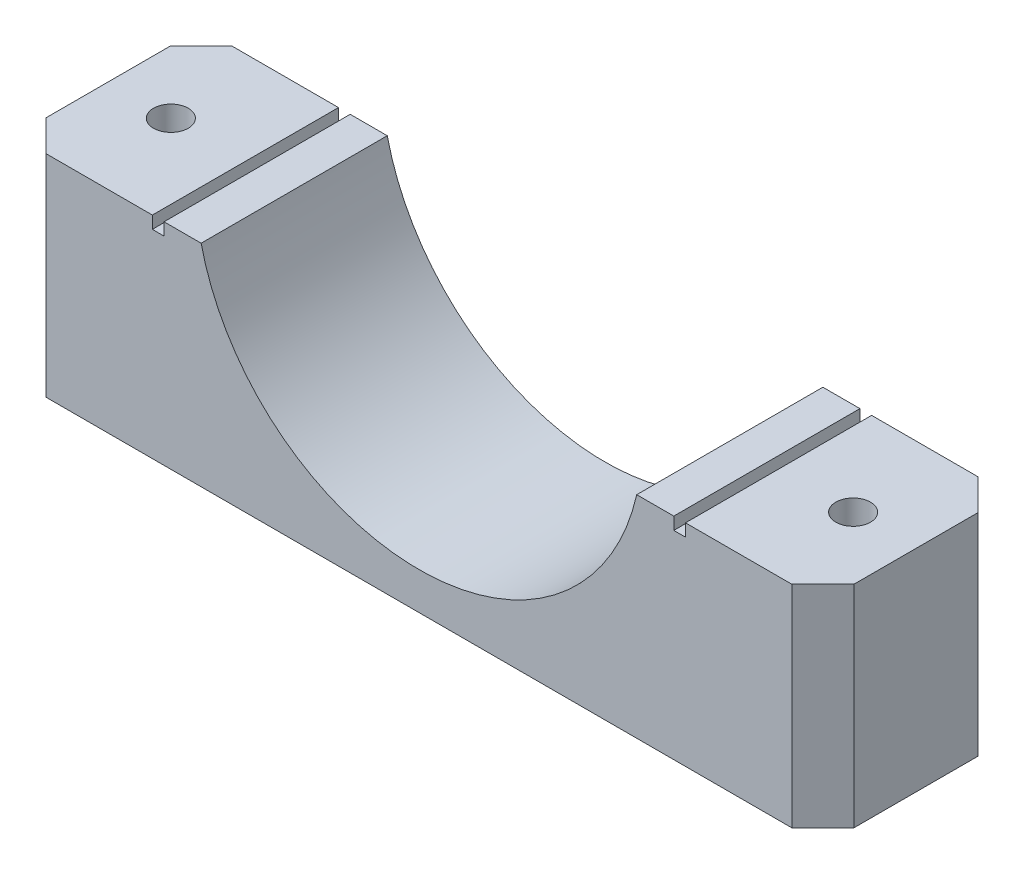
ISO-10303-21;
HEADER;
FILE_DESCRIPTION(('STEP AP214'),'2;1');
FILE_NAME('part.step','',(''),(''),'','','');
FILE_SCHEMA(('AUTOMOTIVE_DESIGN { 1 0 10303 214 1 1 1 1 }'));
ENDSEC;
DATA;
#1=APPLICATION_CONTEXT('core data for automotive mechanical design processes');
#2=APPLICATION_PROTOCOL_DEFINITION('international standard','automotive_design',2000,#1);
#3=PRODUCT_CONTEXT('',#1,'mechanical');
#4=PRODUCT('Part','Part','',(#3));
#5=PRODUCT_RELATED_PRODUCT_CATEGORY('part','',(#4));
#6=PRODUCT_DEFINITION_FORMATION('','',#4);
#7=PRODUCT_DEFINITION_CONTEXT('part definition',#1,'design');
#8=PRODUCT_DEFINITION('design','',#6,#7);
#9=PRODUCT_DEFINITION_SHAPE('','',#8);
#10=(LENGTH_UNIT() NAMED_UNIT(*) SI_UNIT(.MILLI.,.METRE.));
#11=(NAMED_UNIT(*) PLANE_ANGLE_UNIT() SI_UNIT($,.RADIAN.));
#12=(NAMED_UNIT(*) SI_UNIT($,.STERADIAN.) SOLID_ANGLE_UNIT());
#13=UNCERTAINTY_MEASURE_WITH_UNIT(LENGTH_MEASURE(1.E-05),#10,'distance_accuracy_value','');
#14=(GEOMETRIC_REPRESENTATION_CONTEXT(3) GLOBAL_UNCERTAINTY_ASSIGNED_CONTEXT((#13)) GLOBAL_UNIT_ASSIGNED_CONTEXT((#10,
#11,#12)) REPRESENTATION_CONTEXT('',''));
#15=CARTESIAN_POINT('',(0.,0.,0.));
#16=DIRECTION('',(0.,0.,1.));
#17=DIRECTION('',(1.,0.,0.));
#18=AXIS2_PLACEMENT_3D('',#15,#16,#17);
#19=CARTESIAN_POINT('',(32.5499287747842,-4.,15.));
#20=DIRECTION('',(0.,-1.,0.));
#21=DIRECTION('',(1.,0.,0.));
#22=AXIS2_PLACEMENT_3D('',#19,#20,#21);
#23=PLANE('',#22);
#24=CARTESIAN_POINT('',(27.4886444805463,-4.,7.50000000000003));
#25=DIRECTION('',(0.,1.,0.));
#26=DIRECTION('',(-1.,0.,0.));
#27=AXIS2_PLACEMENT_3D('',#24,#25,#26);
#28=CIRCLE('',#27,1.4);
#29=CARTESIAN_POINT('',(26.0886444805463,-4.,7.50000000000003));
#30=VERTEX_POINT('',#29);
#31=EDGE_CURVE('E226',#30,#30,#28,.T.);
#32=ORIENTED_EDGE('',*,*,#31,.F.);
#33=EDGE_LOOP('',(#32));
#34=FACE_BOUND('',#33,.T.);
#35=DIRECTION('',(0.,0.,1.));
#36=VECTOR('',#35,1.);
#37=CARTESIAN_POINT('',(21.4797362047984,-4.,0.));
#38=LINE('',#37,#36);
#39=CARTESIAN_POINT('',(21.4797362047984,-4.,0.));
#40=VERTEX_POINT('',#39);
#41=CARTESIAN_POINT('',(21.4797362047984,-4.,15.));
#42=VERTEX_POINT('',#41);
#43=EDGE_CURVE('E329',#40,#42,#38,.T.);
#44=ORIENTED_EDGE('',*,*,#43,.T.);
#45=DIRECTION('',(-1.,0.,0.));
#46=VECTOR('',#45,1.);
#47=CARTESIAN_POINT('',(32.5499287747842,-4.,15.));
#48=LINE('',#47,#46);
#49=CARTESIAN_POINT('',(30.0499287747842,-4.,15.));
#50=VERTEX_POINT('',#49);
#51=EDGE_CURVE('E189',#50,#42,#48,.T.);
#52=ORIENTED_EDGE('',*,*,#51,.F.);
#53=DIRECTION('',(0.707106781186548,0.,-0.707106781186548));
#54=VECTOR('',#53,1.);
#55=CARTESIAN_POINT('',(30.0499287747842,-4.,15.));
#56=LINE('',#55,#54);
#57=CARTESIAN_POINT('',(32.5499287747842,-4.,12.5));
#58=VERTEX_POINT('',#57);
#59=EDGE_CURVE('E281',#50,#58,#56,.T.);
#60=ORIENTED_EDGE('',*,*,#59,.T.);
#61=DIRECTION('',(0.,0.,-1.));
#62=VECTOR('',#61,1.);
#63=CARTESIAN_POINT('',(32.5499287747842,-4.,15.));
#64=LINE('',#63,#62);
#65=CARTESIAN_POINT('',(32.5499287747842,-4.,2.5));
#66=VERTEX_POINT('',#65);
#67=EDGE_CURVE('E273',#58,#66,#64,.T.);
#68=ORIENTED_EDGE('',*,*,#67,.T.);
#69=DIRECTION('',(0.707106781186548,0.,0.707106781186547));
#70=VECTOR('',#69,1.);
#71=CARTESIAN_POINT('',(32.5499287747842,-4.,2.5));
#72=LINE('',#71,#70);
#73=CARTESIAN_POINT('',(30.0499287747842,-4.,0.));
#74=VERTEX_POINT('',#73);
#75=EDGE_CURVE('E283',#66,#74,#72,.F.);
#76=ORIENTED_EDGE('',*,*,#75,.T.);
#77=DIRECTION('',(-1.,0.,0.));
#78=VECTOR('',#77,1.);
#79=CARTESIAN_POINT('',(32.5499287747842,-4.,0.));
#80=LINE('',#79,#78);
#81=EDGE_CURVE('E247',#74,#40,#80,.T.);
#82=ORIENTED_EDGE('',*,*,#81,.T.);
#83=EDGE_LOOP('',(#44,#52,#60,#68,#76,#82));
#84=FACE_BOUND('',#83,.T.);
#85=ADVANCED_FACE('F43',(#34,#84),#23,.F.);
#86=CARTESIAN_POINT('',(-17.5499287747842,-4.,15.));
#87=DIRECTION('',(0.,-1.,0.));
#88=DIRECTION('',(1.,0.,0.));
#89=AXIS2_PLACEMENT_3D('',#86,#87,#88);
#90=PLANE('',#89);
#91=DIRECTION('',(0.,0.,1.));
#92=VECTOR('',#91,1.);
#93=CARTESIAN_POINT('',(-20.5370518572524,-4.,0.));
#94=LINE('',#93,#92);
#95=CARTESIAN_POINT('',(-20.5370518572524,-4.,0.));
#96=VERTEX_POINT('',#95);
#97=CARTESIAN_POINT('',(-20.5370518572524,-4.,15.));
#98=VERTEX_POINT('',#97);
#99=EDGE_CURVE('E207',#96,#98,#94,.T.);
#100=ORIENTED_EDGE('',*,*,#99,.T.);
#101=DIRECTION('',(-1.,0.,0.));
#102=VECTOR('',#101,1.);
#103=CARTESIAN_POINT('',(-17.5499287747842,-4.,15.));
#104=LINE('',#103,#102);
#105=CARTESIAN_POINT('',(-17.5499287747842,-4.,15.));
#106=VERTEX_POINT('',#105);
#107=EDGE_CURVE('E240',#106,#98,#104,.T.);
#108=ORIENTED_EDGE('',*,*,#107,.F.);
#109=DIRECTION('',(0.,0.,-1.));
#110=VECTOR('',#109,1.);
#111=CARTESIAN_POINT('',(-17.5499287747842,-4.,15.));
#112=LINE('',#111,#110);
#113=CARTESIAN_POINT('',(-17.5499287747842,-4.,0.));
#114=VERTEX_POINT('',#113);
#115=EDGE_CURVE('E268',#106,#114,#112,.T.);
#116=ORIENTED_EDGE('',*,*,#115,.T.);
#117=DIRECTION('',(-1.,0.,0.));
#118=VECTOR('',#117,1.);
#119=CARTESIAN_POINT('',(-17.5499287747842,-4.,0.));
#120=LINE('',#119,#118);
#121=EDGE_CURVE('E254',#114,#96,#120,.T.);
#122=ORIENTED_EDGE('',*,*,#121,.T.);
#123=EDGE_LOOP('',(#100,#108,#116,#122));
#124=FACE_BOUND('',#123,.T.);
#125=ADVANCED_FACE('F355',(#124),#90,.F.);
#126=CARTESIAN_POINT('',(32.5499287747842,-21.,15.));
#127=DIRECTION('',(-1.,0.,0.));
#128=DIRECTION('',(0.,0.,1.));
#129=AXIS2_PLACEMENT_3D('',#126,#127,#128);
#130=PLANE('',#129);
#131=DIRECTION('',(0.,0.,-1.));
#132=VECTOR('',#131,1.);
#133=CARTESIAN_POINT('',(32.5499287747842,-21.,15.));
#134=LINE('',#133,#132);
#135=CARTESIAN_POINT('',(32.5499287747842,-21.,12.5));
#136=VERTEX_POINT('',#135);
#137=CARTESIAN_POINT('',(32.5499287747842,-21.,2.5));
#138=VERTEX_POINT('',#137);
#139=EDGE_CURVE('E246',#136,#138,#134,.T.);
#140=ORIENTED_EDGE('',*,*,#139,.T.);
#141=DIRECTION('',(0.,1.,0.));
#142=VECTOR('',#141,1.);
#143=CARTESIAN_POINT('',(32.5499287747842,-21.,2.5));
#144=LINE('',#143,#142);
#145=EDGE_CURVE('E278',#138,#66,#144,.T.);
#146=ORIENTED_EDGE('',*,*,#145,.T.);
#147=ORIENTED_EDGE('',*,*,#67,.F.);
#148=DIRECTION('',(0.,-1.,0.));
#149=VECTOR('',#148,1.);
#150=CARTESIAN_POINT('',(32.5499287747842,-21.,12.5));
#151=LINE('',#150,#149);
#152=EDGE_CURVE('E276',#58,#136,#151,.T.);
#153=ORIENTED_EDGE('',*,*,#152,.T.);
#154=EDGE_LOOP('',(#140,#146,#147,#153));
#155=FACE_BOUND('',#154,.T.);
#156=ADVANCED_FACE('F378',(#155),#130,.F.);
#157=CARTESIAN_POINT('',(20.5370518572524,-4.,15.));
#158=VERTEX_POINT('',#157);
#159=CARTESIAN_POINT('',(17.5499287747842,-4.,15.));
#160=VERTEX_POINT('',#159);
#161=EDGE_CURVE('E236',#158,#160,#48,.T.);
#162=ORIENTED_EDGE('',*,*,#161,.F.);
#163=DIRECTION('',(0.,0.,1.));
#164=VECTOR('',#163,1.);
#165=CARTESIAN_POINT('',(20.5370518572524,-4.,0.));
#166=LINE('',#165,#164);
#167=CARTESIAN_POINT('',(20.5370518572524,-4.,0.));
#168=VERTEX_POINT('',#167);
#169=EDGE_CURVE('E183',#168,#158,#166,.T.);
#170=ORIENTED_EDGE('',*,*,#169,.F.);
#171=CARTESIAN_POINT('',(17.5499287747842,-4.,0.));
#172=VERTEX_POINT('',#171);
#173=EDGE_CURVE('E225',#168,#172,#80,.T.);
#174=ORIENTED_EDGE('',*,*,#173,.T.);
#175=DIRECTION('',(0.,0.,-1.));
#176=VECTOR('',#175,1.);
#177=CARTESIAN_POINT('',(17.5499287747842,-4.,15.));
#178=LINE('',#177,#176);
#179=EDGE_CURVE('E270',#160,#172,#178,.T.);
#180=ORIENTED_EDGE('',*,*,#179,.F.);
#181=EDGE_LOOP('',(#162,#170,#174,#180));
#182=FACE_BOUND('',#181,.T.);
#183=ADVANCED_FACE('F343',(#182),#23,.F.);
#184=CARTESIAN_POINT('',(0.,0.,15.));
#185=DIRECTION('',(0.,0.,-1.));
#186=DIRECTION('',(-1.,0.,0.));
#187=AXIS2_PLACEMENT_3D('',#184,#185,#186);
#188=CYLINDRICAL_SURFACE('',#187,18.);
#189=CARTESIAN_POINT('',(0.,0.,0.));
#190=DIRECTION('',(0.,0.,1.));
#191=DIRECTION('',(1.,0.,0.));
#192=AXIS2_PLACEMENT_3D('',#189,#190,#191);
#193=CIRCLE('',#192,18.);
#194=EDGE_CURVE('E250',#114,#172,#193,.T.);
#195=ORIENTED_EDGE('',*,*,#194,.F.);
#196=ORIENTED_EDGE('',*,*,#115,.F.);
#197=CARTESIAN_POINT('',(0.,0.,15.));
#198=DIRECTION('',(0.,0.,1.));
#199=DIRECTION('',(1.,0.,0.));
#200=AXIS2_PLACEMENT_3D('',#197,#198,#199);
#201=CIRCLE('',#200,18.);
#202=EDGE_CURVE('E235',#106,#160,#201,.T.);
#203=ORIENTED_EDGE('',*,*,#202,.T.);
#204=ORIENTED_EDGE('',*,*,#179,.T.);
#205=EDGE_LOOP('',(#195,#196,#203,#204));
#206=FACE_BOUND('',#205,.T.);
#207=ADVANCED_FACE('F349',(#206),#188,.F.);
#208=CARTESIAN_POINT('',(-27.4886444805463,-4.00000000000002,7.50000000000003));
#209=DIRECTION('',(0.,1.,0.));
#210=DIRECTION('',(1.,0.,0.));
#211=AXIS2_PLACEMENT_3D('',#208,#209,#210);
#212=CIRCLE('',#211,1.4);
#213=CARTESIAN_POINT('',(-26.0886444805463,-4.00000000000002,7.50000000000003));
#214=VERTEX_POINT('',#213);
#215=EDGE_CURVE('E229',#214,#214,#212,.T.);
#216=ORIENTED_EDGE('',*,*,#215,.F.);
#217=EDGE_LOOP('',(#216));
#218=FACE_BOUND('',#217,.T.);
#219=CARTESIAN_POINT('',(-21.4797362047984,-4.,15.));
#220=VERTEX_POINT('',#219);
#221=CARTESIAN_POINT('',(-30.0499287747842,-4.,15.));
#222=VERTEX_POINT('',#221);
#223=EDGE_CURVE('E239',#220,#222,#104,.T.);
#224=ORIENTED_EDGE('',*,*,#223,.F.);
#225=DIRECTION('',(0.,0.,1.));
#226=VECTOR('',#225,1.);
#227=CARTESIAN_POINT('',(-21.4797362047984,-4.,0.));
#228=LINE('',#227,#226);
#229=CARTESIAN_POINT('',(-21.4797362047984,-4.,0.));
#230=VERTEX_POINT('',#229);
#231=EDGE_CURVE('E198',#230,#220,#228,.T.);
#232=ORIENTED_EDGE('',*,*,#231,.F.);
#233=CARTESIAN_POINT('',(-30.0499287747842,-4.,0.));
#234=VERTEX_POINT('',#233);
#235=EDGE_CURVE('E253',#230,#234,#120,.T.);
#236=ORIENTED_EDGE('',*,*,#235,.T.);
#237=DIRECTION('',(0.707106781186548,0.,-0.707106781186547));
#238=VECTOR('',#237,1.);
#239=CARTESIAN_POINT('',(-32.5499287747842,-4.,2.5));
#240=LINE('',#239,#238);
#241=CARTESIAN_POINT('',(-32.5499287747842,-4.,2.5));
#242=VERTEX_POINT('',#241);
#243=EDGE_CURVE('E11',#234,#242,#240,.F.);
#244=ORIENTED_EDGE('',*,*,#243,.T.);
#245=DIRECTION('',(0.,0.,-1.));
#246=VECTOR('',#245,1.);
#247=CARTESIAN_POINT('',(-32.5499287747842,-4.,15.));
#248=LINE('',#247,#246);
#249=CARTESIAN_POINT('',(-32.5499287747842,-4.,12.5));
#250=VERTEX_POINT('',#249);
#251=EDGE_CURVE('E265',#250,#242,#248,.T.);
#252=ORIENTED_EDGE('',*,*,#251,.F.);
#253=DIRECTION('',(0.707106781186548,0.,0.707106781186548));
#254=VECTOR('',#253,1.);
#255=CARTESIAN_POINT('',(-30.0499287747842,-4.,15.));
#256=LINE('',#255,#254);
#257=EDGE_CURVE('E52',#250,#222,#256,.T.);
#258=ORIENTED_EDGE('',*,*,#257,.T.);
#259=EDGE_LOOP('',(#224,#232,#236,#244,#252,#258));
#260=FACE_BOUND('',#259,.T.);
#261=ADVANCED_FACE('F313',(#218,#260),#90,.F.);
#262=CARTESIAN_POINT('',(-32.5499287747842,-4.,15.));
#263=DIRECTION('',(1.,0.,0.));
#264=DIRECTION('',(0.,0.,-1.));
#265=AXIS2_PLACEMENT_3D('',#262,#263,#264);
#266=PLANE('',#265);
#267=ORIENTED_EDGE('',*,*,#251,.T.);
#268=DIRECTION('',(0.,-1.,0.));
#269=VECTOR('',#268,1.);
#270=CARTESIAN_POINT('',(-32.5499287747842,-4.,2.5));
#271=LINE('',#270,#269);
#272=CARTESIAN_POINT('',(-32.5499287747842,-21.,2.5));
#273=VERTEX_POINT('',#272);
#274=EDGE_CURVE('E305',#242,#273,#271,.T.);
#275=ORIENTED_EDGE('',*,*,#274,.T.);
#276=DIRECTION('',(0.,0.,-1.));
#277=VECTOR('',#276,1.);
#278=CARTESIAN_POINT('',(-32.5499287747842,-21.,15.));
#279=LINE('',#278,#277);
#280=CARTESIAN_POINT('',(-32.5499287747842,-21.,12.5));
#281=VERTEX_POINT('',#280);
#282=EDGE_CURVE('E262',#281,#273,#279,.T.);
#283=ORIENTED_EDGE('',*,*,#282,.F.);
#284=DIRECTION('',(0.,1.,0.));
#285=VECTOR('',#284,1.);
#286=CARTESIAN_POINT('',(-32.5499287747842,-4.,12.5));
#287=LINE('',#286,#285);
#288=EDGE_CURVE('E303',#281,#250,#287,.T.);
#289=ORIENTED_EDGE('',*,*,#288,.T.);
#290=EDGE_LOOP('',(#267,#275,#283,#289));
#291=FACE_BOUND('',#290,.T.);
#292=ADVANCED_FACE('F371',(#291),#266,.F.);
#293=CARTESIAN_POINT('',(-32.5499287747842,-21.,15.));
#294=DIRECTION('',(0.,1.,0.));
#295=DIRECTION('',(0.,0.,1.));
#296=AXIS2_PLACEMENT_3D('',#293,#294,#295);
#297=PLANE('',#296);
#298=CARTESIAN_POINT('',(27.4886444805463,-21.,7.50000000000003));
#299=DIRECTION('',(0.,1.,0.));
#300=DIRECTION('',(-1.,0.,0.));
#301=AXIS2_PLACEMENT_3D('',#298,#299,#300);
#302=CIRCLE('',#301,1.4);
#303=CARTESIAN_POINT('',(26.0886444805463,-21.,7.50000000000003));
#304=VERTEX_POINT('',#303);
#305=EDGE_CURVE('E222',#304,#304,#302,.T.);
#306=ORIENTED_EDGE('',*,*,#305,.T.);
#307=EDGE_LOOP('',(#306));
#308=FACE_BOUND('',#307,.T.);
#309=CARTESIAN_POINT('',(-27.4886444805463,-21.,7.50000000000003));
#310=DIRECTION('',(0.,1.,0.));
#311=DIRECTION('',(1.,0.,0.));
#312=AXIS2_PLACEMENT_3D('',#309,#310,#311);
#313=CIRCLE('',#312,1.4);
#314=CARTESIAN_POINT('',(-26.0886444805463,-21.,7.50000000000003));
#315=VERTEX_POINT('',#314);
#316=EDGE_CURVE('E215',#315,#315,#313,.T.);
#317=ORIENTED_EDGE('',*,*,#316,.T.);
#318=EDGE_LOOP('',(#317));
#319=FACE_BOUND('',#318,.T.);
#320=DIRECTION('',(1.,0.,0.));
#321=VECTOR('',#320,1.);
#322=CARTESIAN_POINT('',(-32.5499287747842,-21.,0.));
#323=LINE('',#322,#321);
#324=CARTESIAN_POINT('',(-30.0499287747842,-21.,0.));
#325=VERTEX_POINT('',#324);
#326=CARTESIAN_POINT('',(30.0499287747842,-21.,0.));
#327=VERTEX_POINT('',#326);
#328=EDGE_CURVE('E257',#325,#327,#323,.T.);
#329=ORIENTED_EDGE('',*,*,#328,.T.);
#330=DIRECTION('',(-0.707106781186548,0.,-0.707106781186547));
#331=VECTOR('',#330,1.);
#332=CARTESIAN_POINT('',(32.5499287747842,-21.,2.5));
#333=LINE('',#332,#331);
#334=EDGE_CURVE('E296',#327,#138,#333,.F.);
#335=ORIENTED_EDGE('',*,*,#334,.T.);
#336=ORIENTED_EDGE('',*,*,#139,.F.);
#337=DIRECTION('',(-0.707106781186548,0.,0.707106781186548));
#338=VECTOR('',#337,1.);
#339=CARTESIAN_POINT('',(30.0499287747842,-21.,15.));
#340=LINE('',#339,#338);
#341=CARTESIAN_POINT('',(30.0499287747842,-21.,15.));
#342=VERTEX_POINT('',#341);
#343=EDGE_CURVE('E294',#136,#342,#340,.T.);
#344=ORIENTED_EDGE('',*,*,#343,.T.);
#345=DIRECTION('',(1.,0.,0.));
#346=VECTOR('',#345,1.);
#347=CARTESIAN_POINT('',(-32.5499287747842,-21.,15.));
#348=LINE('',#347,#346);
#349=CARTESIAN_POINT('',(-30.0499287747842,-21.,15.));
#350=VERTEX_POINT('',#349);
#351=EDGE_CURVE('E243',#350,#342,#348,.T.);
#352=ORIENTED_EDGE('',*,*,#351,.F.);
#353=DIRECTION('',(-0.707106781186548,0.,-0.707106781186548));
#354=VECTOR('',#353,1.);
#355=CARTESIAN_POINT('',(-30.0499287747842,-21.,15.));
#356=LINE('',#355,#354);
#357=EDGE_CURVE('E290',#350,#281,#356,.T.);
#358=ORIENTED_EDGE('',*,*,#357,.T.);
#359=ORIENTED_EDGE('',*,*,#282,.T.);
#360=DIRECTION('',(-0.707106781186548,0.,0.707106781186547));
#361=VECTOR('',#360,1.);
#362=CARTESIAN_POINT('',(-32.5499287747842,-21.,2.5));
#363=LINE('',#362,#361);
#364=EDGE_CURVE('E292',#273,#325,#363,.F.);
#365=ORIENTED_EDGE('',*,*,#364,.T.);
#366=EDGE_LOOP('',(#329,#335,#336,#344,#352,#358,#359,#365));
#367=FACE_BOUND('',#366,.T.);
#368=ADVANCED_FACE('F320',(#308,#319,#367),#297,.F.);
#369=CARTESIAN_POINT('',(0.,0.,15.));
#370=DIRECTION('',(0.,0.,1.));
#371=DIRECTION('',(1.,0.,0.));
#372=AXIS2_PLACEMENT_3D('',#369,#370,#371);
#373=PLANE('',#372);
#374=DIRECTION('',(0.,1.,0.));
#375=VECTOR('',#374,1.);
#376=CARTESIAN_POINT('',(20.5370518572524,-5.,15.));
#377=LINE('',#376,#375);
#378=CARTESIAN_POINT('',(20.5370518572524,-5.,15.));
#379=VERTEX_POINT('',#378);
#380=EDGE_CURVE('E210',#379,#158,#377,.T.);
#381=ORIENTED_EDGE('',*,*,#380,.T.);
#382=ORIENTED_EDGE('',*,*,#161,.T.);
#383=ORIENTED_EDGE('',*,*,#202,.F.);
#384=ORIENTED_EDGE('',*,*,#107,.T.);
#385=DIRECTION('',(0.,1.,0.));
#386=VECTOR('',#385,1.);
#387=CARTESIAN_POINT('',(-20.5370518572524,-5.,15.));
#388=LINE('',#387,#386);
#389=CARTESIAN_POINT('',(-20.5370518572524,-5.,15.));
#390=VERTEX_POINT('',#389);
#391=EDGE_CURVE('E206',#390,#98,#388,.T.);
#392=ORIENTED_EDGE('',*,*,#391,.F.);
#393=DIRECTION('',(1.,0.,0.));
#394=VECTOR('',#393,1.);
#395=CARTESIAN_POINT('',(-21.4797362047984,-5.,15.));
#396=LINE('',#395,#394);
#397=CARTESIAN_POINT('',(-21.4797362047984,-5.,15.));
#398=VERTEX_POINT('',#397);
#399=EDGE_CURVE('E196',#398,#390,#396,.T.);
#400=ORIENTED_EDGE('',*,*,#399,.F.);
#401=DIRECTION('',(0.,1.,0.));
#402=VECTOR('',#401,1.);
#403=CARTESIAN_POINT('',(-21.4797362047984,-5.,15.));
#404=LINE('',#403,#402);
#405=EDGE_CURVE('E212',#398,#220,#404,.T.);
#406=ORIENTED_EDGE('',*,*,#405,.T.);
#407=ORIENTED_EDGE('',*,*,#223,.T.);
#408=DIRECTION('',(0.,-1.,0.));
#409=VECTOR('',#408,1.);
#410=CARTESIAN_POINT('',(-30.0499287747842,-21.,15.));
#411=LINE('',#410,#409);
#412=EDGE_CURVE('E298',#222,#350,#411,.T.);
#413=ORIENTED_EDGE('',*,*,#412,.T.);
#414=ORIENTED_EDGE('',*,*,#351,.T.);
#415=DIRECTION('',(0.,1.,0.));
#416=VECTOR('',#415,1.);
#417=CARTESIAN_POINT('',(30.0499287747842,-4.,15.));
#418=LINE('',#417,#416);
#419=EDGE_CURVE('E301',#342,#50,#418,.T.);
#420=ORIENTED_EDGE('',*,*,#419,.T.);
#421=ORIENTED_EDGE('',*,*,#51,.T.);
#422=DIRECTION('',(0.,1.,0.));
#423=VECTOR('',#422,1.);
#424=CARTESIAN_POINT('',(21.4797362047984,-5.,15.));
#425=LINE('',#424,#423);
#426=CARTESIAN_POINT('',(21.4797362047984,-5.,15.));
#427=VERTEX_POINT('',#426);
#428=EDGE_CURVE('E168',#427,#42,#425,.T.);
#429=ORIENTED_EDGE('',*,*,#428,.F.);
#430=DIRECTION('',(-1.,0.,0.));
#431=VECTOR('',#430,1.);
#432=CARTESIAN_POINT('',(21.4797362047984,-5.,15.));
#433=LINE('',#432,#431);
#434=EDGE_CURVE('E174',#427,#379,#433,.T.);
#435=ORIENTED_EDGE('',*,*,#434,.T.);
#436=EDGE_LOOP('',(#381,#382,#383,#384,#392,#400,#406,#407,#413,#414,#420,#421,#429,#435));
#437=FACE_BOUND('',#436,.T.);
#438=ADVANCED_FACE('F186',(#437),#373,.T.);
#439=CARTESIAN_POINT('',(0.,0.,0.));
#440=DIRECTION('',(0.,0.,1.));
#441=DIRECTION('',(1.,0.,0.));
#442=AXIS2_PLACEMENT_3D('',#439,#440,#441);
#443=PLANE('',#442);
#444=ORIENTED_EDGE('',*,*,#173,.F.);
#445=DIRECTION('',(0.,1.,0.));
#446=VECTOR('',#445,1.);
#447=CARTESIAN_POINT('',(20.5370518572524,-5.,0.));
#448=LINE('',#447,#446);
#449=CARTESIAN_POINT('',(20.5370518572524,-5.,0.));
#450=VERTEX_POINT('',#449);
#451=EDGE_CURVE('E191',#450,#168,#448,.T.);
#452=ORIENTED_EDGE('',*,*,#451,.F.);
#453=DIRECTION('',(-1.,0.,0.));
#454=VECTOR('',#453,1.);
#455=CARTESIAN_POINT('',(21.4797362047984,-5.,0.));
#456=LINE('',#455,#454);
#457=CARTESIAN_POINT('',(21.4797362047984,-5.,0.));
#458=VERTEX_POINT('',#457);
#459=EDGE_CURVE('E173',#458,#450,#456,.T.);
#460=ORIENTED_EDGE('',*,*,#459,.F.);
#461=DIRECTION('',(0.,1.,0.));
#462=VECTOR('',#461,1.);
#463=CARTESIAN_POINT('',(21.4797362047984,-5.,0.));
#464=LINE('',#463,#462);
#465=EDGE_CURVE('E171',#458,#40,#464,.T.);
#466=ORIENTED_EDGE('',*,*,#465,.T.);
#467=ORIENTED_EDGE('',*,*,#81,.F.);
#468=DIRECTION('',(0.,-1.,0.));
#469=VECTOR('',#468,1.);
#470=CARTESIAN_POINT('',(30.0499287747842,0.,0.));
#471=LINE('',#470,#469);
#472=EDGE_CURVE('E288',#74,#327,#471,.T.);
#473=ORIENTED_EDGE('',*,*,#472,.T.);
#474=ORIENTED_EDGE('',*,*,#328,.F.);
#475=DIRECTION('',(0.,1.,0.));
#476=VECTOR('',#475,1.);
#477=CARTESIAN_POINT('',(-30.0499287747842,0.,0.));
#478=LINE('',#477,#476);
#479=EDGE_CURVE('E285',#325,#234,#478,.T.);
#480=ORIENTED_EDGE('',*,*,#479,.T.);
#481=ORIENTED_EDGE('',*,*,#235,.F.);
#482=DIRECTION('',(0.,1.,0.));
#483=VECTOR('',#482,1.);
#484=CARTESIAN_POINT('',(-21.4797362047984,-5.,0.));
#485=LINE('',#484,#483);
#486=CARTESIAN_POINT('',(-21.4797362047984,-5.,0.));
#487=VERTEX_POINT('',#486);
#488=EDGE_CURVE('E216',#487,#230,#485,.T.);
#489=ORIENTED_EDGE('',*,*,#488,.F.);
#490=DIRECTION('',(1.,0.,0.));
#491=VECTOR('',#490,1.);
#492=CARTESIAN_POINT('',(-21.4797362047984,-5.,0.));
#493=LINE('',#492,#491);
#494=CARTESIAN_POINT('',(-20.5370518572524,-5.,0.));
#495=VERTEX_POINT('',#494);
#496=EDGE_CURVE('E200',#487,#495,#493,.T.);
#497=ORIENTED_EDGE('',*,*,#496,.T.);
#498=DIRECTION('',(0.,1.,0.));
#499=VECTOR('',#498,1.);
#500=CARTESIAN_POINT('',(-20.5370518572524,-5.,0.));
#501=LINE('',#500,#499);
#502=EDGE_CURVE('E218',#495,#96,#501,.T.);
#503=ORIENTED_EDGE('',*,*,#502,.T.);
#504=ORIENTED_EDGE('',*,*,#121,.F.);
#505=ORIENTED_EDGE('',*,*,#194,.T.);
#506=EDGE_LOOP('',(#444,#452,#460,#466,#467,#473,#474,#480,#481,#489,#497,#503,#504,#505));
#507=FACE_BOUND('',#506,.T.);
#508=ADVANCED_FACE('F345',(#507),#443,.F.);
#509=CARTESIAN_POINT('',(32.5499287747842,-21.,2.5));
#510=DIRECTION('',(-0.707106781186547,0.,0.707106781186548));
#511=DIRECTION('',(0.,1.,0.));
#512=AXIS2_PLACEMENT_3D('',#509,#510,#511);
#513=PLANE('',#512);
#514=ORIENTED_EDGE('',*,*,#334,.F.);
#515=ORIENTED_EDGE('',*,*,#472,.F.);
#516=ORIENTED_EDGE('',*,*,#75,.F.);
#517=ORIENTED_EDGE('',*,*,#145,.F.);
#518=EDGE_LOOP('',(#514,#515,#516,#517));
#519=FACE_BOUND('',#518,.T.);
#520=ADVANCED_FACE('F376',(#519),#513,.F.);
#521=CARTESIAN_POINT('',(30.0499287747842,0.,15.));
#522=DIRECTION('',(0.707106781186547,0.,0.707106781186547));
#523=DIRECTION('',(0.,-1.,0.));
#524=AXIS2_PLACEMENT_3D('',#521,#522,#523);
#525=PLANE('',#524);
#526=ORIENTED_EDGE('',*,*,#343,.F.);
#527=ORIENTED_EDGE('',*,*,#152,.F.);
#528=ORIENTED_EDGE('',*,*,#59,.F.);
#529=ORIENTED_EDGE('',*,*,#419,.F.);
#530=EDGE_LOOP('',(#526,#527,#528,#529));
#531=FACE_BOUND('',#530,.T.);
#532=ADVANCED_FACE('F326',(#531),#525,.T.);
#533=CARTESIAN_POINT('',(-32.5499287747842,-4.,2.5));
#534=DIRECTION('',(0.707106781186547,0.,0.707106781186548));
#535=DIRECTION('',(0.,-1.,0.));
#536=AXIS2_PLACEMENT_3D('',#533,#534,#535);
#537=PLANE('',#536);
#538=ORIENTED_EDGE('',*,*,#243,.F.);
#539=ORIENTED_EDGE('',*,*,#479,.F.);
#540=ORIENTED_EDGE('',*,*,#364,.F.);
#541=ORIENTED_EDGE('',*,*,#274,.F.);
#542=EDGE_LOOP('',(#538,#539,#540,#541));
#543=FACE_BOUND('',#542,.T.);
#544=ADVANCED_FACE('F369',(#543),#537,.F.);
#545=CARTESIAN_POINT('',(-30.0499287747842,0.,15.));
#546=DIRECTION('',(-0.707106781186547,0.,0.707106781186547));
#547=DIRECTION('',(0.,1.,0.));
#548=AXIS2_PLACEMENT_3D('',#545,#546,#547);
#549=PLANE('',#548);
#550=ORIENTED_EDGE('',*,*,#257,.F.);
#551=ORIENTED_EDGE('',*,*,#288,.F.);
#552=ORIENTED_EDGE('',*,*,#357,.F.);
#553=ORIENTED_EDGE('',*,*,#412,.F.);
#554=EDGE_LOOP('',(#550,#551,#552,#553));
#555=FACE_BOUND('',#554,.T.);
#556=ADVANCED_FACE('F46',(#555),#549,.T.);
#557=CARTESIAN_POINT('',(-27.4886444805463,-21.,7.50000000000003));
#558=DIRECTION('',(0.,1.,0.));
#559=DIRECTION('',(-1.,0.,0.));
#560=AXIS2_PLACEMENT_3D('',#557,#558,#559);
#561=CYLINDRICAL_SURFACE('',#560,1.4);
#562=ORIENTED_EDGE('',*,*,#316,.F.);
#563=EDGE_LOOP('',(#562));
#564=FACE_BOUND('',#563,.T.);
#565=ORIENTED_EDGE('',*,*,#215,.T.);
#566=EDGE_LOOP('',(#565));
#567=FACE_BOUND('',#566,.T.);
#568=ADVANCED_FACE('F408',(#564,#567),#561,.F.);
#569=CARTESIAN_POINT('',(27.4886444805463,-21.,7.50000000000003));
#570=DIRECTION('',(0.,1.,0.));
#571=DIRECTION('',(-1.,0.,0.));
#572=AXIS2_PLACEMENT_3D('',#569,#570,#571);
#573=CYLINDRICAL_SURFACE('',#572,1.4);
#574=ORIENTED_EDGE('',*,*,#305,.F.);
#575=EDGE_LOOP('',(#574));
#576=FACE_BOUND('',#575,.T.);
#577=ORIENTED_EDGE('',*,*,#31,.T.);
#578=EDGE_LOOP('',(#577));
#579=FACE_BOUND('',#578,.T.);
#580=ADVANCED_FACE('F411',(#576,#579),#573,.F.);
#581=CARTESIAN_POINT('',(-21.4797362047984,-5.,0.));
#582=DIRECTION('',(-1.,0.,0.));
#583=DIRECTION('',(0.,-1.,0.));
#584=AXIS2_PLACEMENT_3D('',#581,#582,#583);
#585=PLANE('',#584);
#586=ORIENTED_EDGE('',*,*,#231,.T.);
#587=ORIENTED_EDGE('',*,*,#405,.F.);
#588=DIRECTION('',(0.,0.,1.));
#589=VECTOR('',#588,1.);
#590=CARTESIAN_POINT('',(-21.4797362047984,-5.,0.));
#591=LINE('',#590,#589);
#592=EDGE_CURVE('E203',#487,#398,#591,.T.);
#593=ORIENTED_EDGE('',*,*,#592,.F.);
#594=ORIENTED_EDGE('',*,*,#488,.T.);
#595=EDGE_LOOP('',(#586,#587,#593,#594));
#596=FACE_BOUND('',#595,.T.);
#597=ADVANCED_FACE('F363',(#596),#585,.F.);
#598=CARTESIAN_POINT('',(-20.5370518572524,-5.,0.));
#599=DIRECTION('',(-1.,0.,0.));
#600=DIRECTION('',(0.,-1.,0.));
#601=AXIS2_PLACEMENT_3D('',#598,#599,#600);
#602=PLANE('',#601);
#603=ORIENTED_EDGE('',*,*,#99,.F.);
#604=ORIENTED_EDGE('',*,*,#502,.F.);
#605=DIRECTION('',(0.,0.,1.));
#606=VECTOR('',#605,1.);
#607=CARTESIAN_POINT('',(-20.5370518572524,-5.,0.));
#608=LINE('',#607,#606);
#609=EDGE_CURVE('E67',#495,#390,#608,.T.);
#610=ORIENTED_EDGE('',*,*,#609,.T.);
#611=ORIENTED_EDGE('',*,*,#391,.T.);
#612=EDGE_LOOP('',(#603,#604,#610,#611));
#613=FACE_BOUND('',#612,.T.);
#614=ADVANCED_FACE('F357',(#613),#602,.T.);
#615=CARTESIAN_POINT('',(0.,-5.,0.));
#616=DIRECTION('',(0.,-1.,0.));
#617=DIRECTION('',(0.,0.,-1.));
#618=AXIS2_PLACEMENT_3D('',#615,#616,#617);
#619=PLANE('',#618);
#620=ORIENTED_EDGE('',*,*,#399,.T.);
#621=ORIENTED_EDGE('',*,*,#609,.F.);
#622=ORIENTED_EDGE('',*,*,#496,.F.);
#623=ORIENTED_EDGE('',*,*,#592,.T.);
#624=EDGE_LOOP('',(#620,#621,#622,#623));
#625=FACE_BOUND('',#624,.T.);
#626=ADVANCED_FACE('F361',(#625),#619,.F.);
#627=CARTESIAN_POINT('',(20.5370518572524,-5.,0.));
#628=DIRECTION('',(-1.,0.,0.));
#629=DIRECTION('',(0.,-1.,0.));
#630=AXIS2_PLACEMENT_3D('',#627,#628,#629);
#631=PLANE('',#630);
#632=ORIENTED_EDGE('',*,*,#169,.T.);
#633=ORIENTED_EDGE('',*,*,#380,.F.);
#634=DIRECTION('',(0.,0.,1.));
#635=VECTOR('',#634,1.);
#636=CARTESIAN_POINT('',(20.5370518572524,-5.,0.));
#637=LINE('',#636,#635);
#638=EDGE_CURVE('E180',#450,#379,#637,.T.);
#639=ORIENTED_EDGE('',*,*,#638,.F.);
#640=ORIENTED_EDGE('',*,*,#451,.T.);
#641=EDGE_LOOP('',(#632,#633,#639,#640));
#642=FACE_BOUND('',#641,.T.);
#643=ADVANCED_FACE('F338',(#642),#631,.F.);
#644=CARTESIAN_POINT('',(21.4797362047984,-5.,0.));
#645=DIRECTION('',(-1.,0.,0.));
#646=DIRECTION('',(0.,-1.,0.));
#647=AXIS2_PLACEMENT_3D('',#644,#645,#646);
#648=PLANE('',#647);
#649=ORIENTED_EDGE('',*,*,#43,.F.);
#650=ORIENTED_EDGE('',*,*,#465,.F.);
#651=DIRECTION('',(0.,0.,1.));
#652=VECTOR('',#651,1.);
#653=CARTESIAN_POINT('',(21.4797362047984,-5.,0.));
#654=LINE('',#653,#652);
#655=EDGE_CURVE('E59',#458,#427,#654,.T.);
#656=ORIENTED_EDGE('',*,*,#655,.T.);
#657=ORIENTED_EDGE('',*,*,#428,.T.);
#658=EDGE_LOOP('',(#649,#650,#656,#657));
#659=FACE_BOUND('',#658,.T.);
#660=ADVANCED_FACE('F166',(#659),#648,.T.);
#661=CARTESIAN_POINT('',(0.,-5.,0.));
#662=DIRECTION('',(0.,-1.,0.));
#663=DIRECTION('',(0.,0.,-1.));
#664=AXIS2_PLACEMENT_3D('',#661,#662,#663);
#665=PLANE('',#664);
#666=ORIENTED_EDGE('',*,*,#434,.F.);
#667=ORIENTED_EDGE('',*,*,#655,.F.);
#668=ORIENTED_EDGE('',*,*,#459,.T.);
#669=ORIENTED_EDGE('',*,*,#638,.T.);
#670=EDGE_LOOP('',(#666,#667,#668,#669));
#671=FACE_BOUND('',#670,.T.);
#672=ADVANCED_FACE('F178',(#671),#665,.F.);
#673=CLOSED_SHELL('',(#85,#125,#156,#183,#207,#261,#292,#368,#438,#508,#520,#532,#544,#556,#568,
#580,#597,#614,#626,#643,#660,#672));
#674=MANIFOLD_SOLID_BREP('B2',#673);
#675=ADVANCED_BREP_SHAPE_REPRESENTATION('',(#18,#674),#14);
#676=SHAPE_DEFINITION_REPRESENTATION(#9,#675);
ENDSEC;
END-ISO-10303-21;
